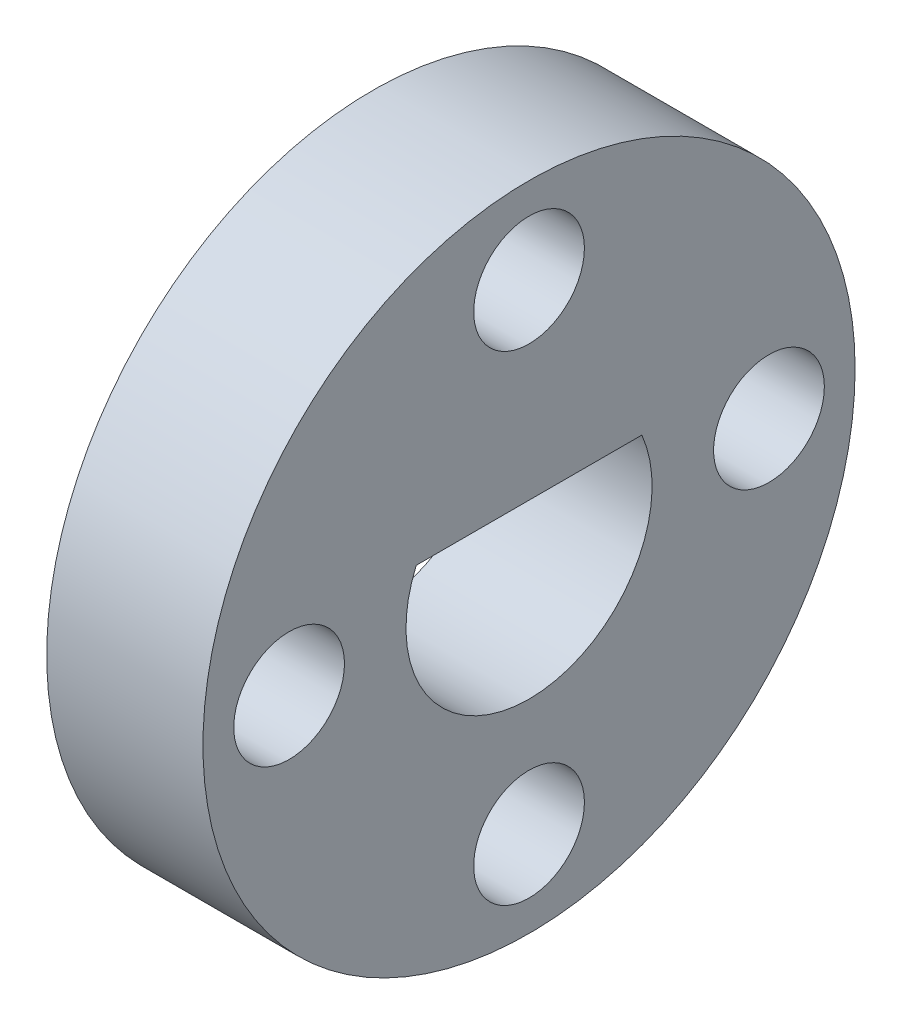
ISO-10303-21;
HEADER;
FILE_DESCRIPTION(('STEP AP214'),'2;1');
FILE_NAME('part.step','',(''),(''),'','','');
FILE_SCHEMA(('AUTOMOTIVE_DESIGN { 1 0 10303 214 1 1 1 1 }'));
ENDSEC;
DATA;
#1=APPLICATION_CONTEXT('core data for automotive mechanical design processes');
#2=APPLICATION_PROTOCOL_DEFINITION('international standard','automotive_design',2000,#1);
#3=PRODUCT_CONTEXT('',#1,'mechanical');
#4=PRODUCT('Part','Part','',(#3));
#5=PRODUCT_RELATED_PRODUCT_CATEGORY('part','',(#4));
#6=PRODUCT_DEFINITION_FORMATION('','',#4);
#7=PRODUCT_DEFINITION_CONTEXT('part definition',#1,'design');
#8=PRODUCT_DEFINITION('design','',#6,#7);
#9=PRODUCT_DEFINITION_SHAPE('','',#8);
#10=(LENGTH_UNIT() NAMED_UNIT(*) SI_UNIT(.MILLI.,.METRE.));
#11=(NAMED_UNIT(*) PLANE_ANGLE_UNIT() SI_UNIT($,.RADIAN.));
#12=(NAMED_UNIT(*) SI_UNIT($,.STERADIAN.) SOLID_ANGLE_UNIT());
#13=UNCERTAINTY_MEASURE_WITH_UNIT(LENGTH_MEASURE(1.E-05),#10,'distance_accuracy_value','');
#14=(GEOMETRIC_REPRESENTATION_CONTEXT(3) GLOBAL_UNCERTAINTY_ASSIGNED_CONTEXT((#13)) GLOBAL_UNIT_ASSIGNED_CONTEXT((#10,
#11,#12)) REPRESENTATION_CONTEXT('',''));
#15=CARTESIAN_POINT('',(0.,0.,0.));
#16=DIRECTION('',(0.,0.,1.));
#17=DIRECTION('',(1.,0.,0.));
#18=AXIS2_PLACEMENT_3D('',#15,#16,#17);
#19=CARTESIAN_POINT('',(6.35,0.,0.));
#20=DIRECTION('',(1.,0.,0.));
#21=DIRECTION('',(0.,0.,-1.));
#22=AXIS2_PLACEMENT_3D('',#19,#20,#21);
#23=PLANE('',#22);
#24=CARTESIAN_POINT('',(6.35,0.,-9.75));
#25=DIRECTION('',(1.,0.,0.));
#26=DIRECTION('',(0.,0.,-1.));
#27=AXIS2_PLACEMENT_3D('',#24,#25,#26);
#28=CIRCLE('',#27,2.25000000000002);
#29=CARTESIAN_POINT('',(6.35,0.,-12.));
#30=VERTEX_POINT('',#29);
#31=EDGE_CURVE('E114',#30,#30,#28,.T.);
#32=ORIENTED_EDGE('',*,*,#31,.F.);
#33=EDGE_LOOP('',(#32));
#34=FACE_BOUND('',#33,.T.);
#35=DIRECTION('',(0.,0.,1.));
#36=VECTOR('',#35,1.);
#37=CARTESIAN_POINT('',(6.35,2.,4.58257569495584));
#38=LINE('',#37,#36);
#39=CARTESIAN_POINT('',(6.35,2.,-4.58257569495584));
#40=VERTEX_POINT('',#39);
#41=CARTESIAN_POINT('',(6.35,2.,4.58257569495584));
#42=VERTEX_POINT('',#41);
#43=EDGE_CURVE('E83',#40,#42,#38,.T.);
#44=ORIENTED_EDGE('',*,*,#43,.F.);
#45=CARTESIAN_POINT('',(6.35,0.,0.));
#46=DIRECTION('',(1.,0.,0.));
#47=DIRECTION('',(0.,0.,-1.));
#48=AXIS2_PLACEMENT_3D('',#45,#46,#47);
#49=CIRCLE('',#48,5.);
#50=EDGE_CURVE('E68',#42,#40,#49,.T.);
#51=ORIENTED_EDGE('',*,*,#50,.F.);
#52=EDGE_LOOP('',(#44,#51));
#53=FACE_BOUND('',#52,.T.);
#54=CARTESIAN_POINT('',(6.35,0.,9.75));
#55=DIRECTION('',(1.,0.,0.));
#56=DIRECTION('',(0.,0.,-1.));
#57=AXIS2_PLACEMENT_3D('',#54,#55,#56);
#58=CIRCLE('',#57,2.25);
#59=CARTESIAN_POINT('',(6.35,0.,7.5));
#60=VERTEX_POINT('',#59);
#61=EDGE_CURVE('E87',#60,#60,#58,.T.);
#62=ORIENTED_EDGE('',*,*,#61,.F.);
#63=EDGE_LOOP('',(#62));
#64=FACE_BOUND('',#63,.T.);
#65=CARTESIAN_POINT('',(6.35,0.,0.));
#66=DIRECTION('',(1.,0.,0.));
#67=DIRECTION('',(0.,0.,-1.));
#68=AXIS2_PLACEMENT_3D('',#65,#66,#67);
#69=CIRCLE('',#68,13.25);
#70=CARTESIAN_POINT('',(6.35,0.,-13.25));
#71=VERTEX_POINT('',#70);
#72=EDGE_CURVE('E11',#71,#71,#69,.T.);
#73=ORIENTED_EDGE('',*,*,#72,.T.);
#74=EDGE_LOOP('',(#73));
#75=FACE_BOUND('',#74,.T.);
#76=CARTESIAN_POINT('',(6.35,9.75,0.));
#77=DIRECTION('',(1.,0.,0.));
#78=DIRECTION('',(0.,0.,-1.));
#79=AXIS2_PLACEMENT_3D('',#76,#77,#78);
#80=CIRCLE('',#79,2.25000000000001);
#81=CARTESIAN_POINT('',(6.35,9.75,-2.25000000000001));
#82=VERTEX_POINT('',#81);
#83=EDGE_CURVE('E77',#82,#82,#80,.T.);
#84=ORIENTED_EDGE('',*,*,#83,.F.);
#85=EDGE_LOOP('',(#84));
#86=FACE_BOUND('',#85,.T.);
#87=CARTESIAN_POINT('',(6.35,-9.75,0.));
#88=DIRECTION('',(1.,0.,0.));
#89=DIRECTION('',(0.,0.,-1.));
#90=AXIS2_PLACEMENT_3D('',#87,#88,#89);
#91=CIRCLE('',#90,2.25000000000003);
#92=CARTESIAN_POINT('',(6.35,-9.75,-2.25000000000003));
#93=VERTEX_POINT('',#92);
#94=EDGE_CURVE('E124',#93,#93,#91,.T.);
#95=ORIENTED_EDGE('',*,*,#94,.F.);
#96=EDGE_LOOP('',(#95));
#97=FACE_BOUND('',#96,.T.);
#98=ADVANCED_FACE('F36',(#34,#53,#64,#75,#86,#97),#23,.T.);
#99=CARTESIAN_POINT('',(0.,0.,0.));
#100=DIRECTION('',(1.,0.,0.));
#101=DIRECTION('',(0.,0.,-1.));
#102=AXIS2_PLACEMENT_3D('',#99,#100,#101);
#103=PLANE('',#102);
#104=CARTESIAN_POINT('',(0.,0.,9.75));
#105=DIRECTION('',(1.,0.,0.));
#106=DIRECTION('',(0.,0.,-1.));
#107=AXIS2_PLACEMENT_3D('',#104,#105,#106);
#108=CIRCLE('',#107,2.25);
#109=CARTESIAN_POINT('',(0.,0.,7.5));
#110=VERTEX_POINT('',#109);
#111=EDGE_CURVE('E73',#110,#110,#108,.T.);
#112=ORIENTED_EDGE('',*,*,#111,.T.);
#113=EDGE_LOOP('',(#112));
#114=FACE_BOUND('',#113,.T.);
#115=CARTESIAN_POINT('',(0.,0.,0.));
#116=DIRECTION('',(1.,0.,0.));
#117=DIRECTION('',(0.,0.,-1.));
#118=AXIS2_PLACEMENT_3D('',#115,#116,#117);
#119=CIRCLE('',#118,13.25);
#120=CARTESIAN_POINT('',(0.,0.,-13.25));
#121=VERTEX_POINT('',#120);
#122=EDGE_CURVE('E40',#121,#121,#119,.T.);
#123=ORIENTED_EDGE('',*,*,#122,.F.);
#124=EDGE_LOOP('',(#123));
#125=FACE_BOUND('',#124,.T.);
#126=CARTESIAN_POINT('',(0.,0.,0.));
#127=DIRECTION('',(1.,0.,0.));
#128=DIRECTION('',(0.,0.,-1.));
#129=AXIS2_PLACEMENT_3D('',#126,#127,#128);
#130=CIRCLE('',#129,5.);
#131=CARTESIAN_POINT('',(0.,2.,4.58257569495584));
#132=VERTEX_POINT('',#131);
#133=CARTESIAN_POINT('',(0.,2.,-4.58257569495584));
#134=VERTEX_POINT('',#133);
#135=EDGE_CURVE('E58',#132,#134,#130,.T.);
#136=ORIENTED_EDGE('',*,*,#135,.T.);
#137=DIRECTION('',(0.,0.,1.));
#138=VECTOR('',#137,1.);
#139=CARTESIAN_POINT('',(0.,2.,4.58257569495584));
#140=LINE('',#139,#138);
#141=EDGE_CURVE('E64',#134,#132,#140,.T.);
#142=ORIENTED_EDGE('',*,*,#141,.T.);
#143=EDGE_LOOP('',(#136,#142));
#144=FACE_BOUND('',#143,.T.);
#145=CARTESIAN_POINT('',(0.,9.75,0.));
#146=DIRECTION('',(1.,0.,0.));
#147=DIRECTION('',(0.,0.,-1.));
#148=AXIS2_PLACEMENT_3D('',#145,#146,#147);
#149=CIRCLE('',#148,2.25000000000001);
#150=CARTESIAN_POINT('',(0.,9.75,-2.25000000000001));
#151=VERTEX_POINT('',#150);
#152=EDGE_CURVE('E80',#151,#151,#149,.T.);
#153=ORIENTED_EDGE('',*,*,#152,.T.);
#154=EDGE_LOOP('',(#153));
#155=FACE_BOUND('',#154,.T.);
#156=CARTESIAN_POINT('',(0.,0.,-9.75));
#157=DIRECTION('',(1.,0.,0.));
#158=DIRECTION('',(0.,0.,-1.));
#159=AXIS2_PLACEMENT_3D('',#156,#157,#158);
#160=CIRCLE('',#159,2.25000000000002);
#161=CARTESIAN_POINT('',(0.,0.,-12.));
#162=VERTEX_POINT('',#161);
#163=EDGE_CURVE('E126',#162,#162,#160,.T.);
#164=ORIENTED_EDGE('',*,*,#163,.T.);
#165=EDGE_LOOP('',(#164));
#166=FACE_BOUND('',#165,.T.);
#167=CARTESIAN_POINT('',(0.,-9.75,0.));
#168=DIRECTION('',(1.,0.,0.));
#169=DIRECTION('',(0.,0.,-1.));
#170=AXIS2_PLACEMENT_3D('',#167,#168,#169);
#171=CIRCLE('',#170,2.25000000000003);
#172=CARTESIAN_POINT('',(0.,-9.75,-2.25000000000003));
#173=VERTEX_POINT('',#172);
#174=EDGE_CURVE('E127',#173,#173,#171,.T.);
#175=ORIENTED_EDGE('',*,*,#174,.T.);
#176=EDGE_LOOP('',(#175));
#177=FACE_BOUND('',#176,.T.);
#178=ADVANCED_FACE('F75',(#114,#125,#144,#155,#166,#177),#103,.F.);
#179=CARTESIAN_POINT('',(6.35,0.,0.));
#180=DIRECTION('',(-1.,0.,0.));
#181=DIRECTION('',(0.,0.,1.));
#182=AXIS2_PLACEMENT_3D('',#179,#180,#181);
#183=CYLINDRICAL_SURFACE('',#182,13.25);
#184=ORIENTED_EDGE('',*,*,#72,.F.);
#185=EDGE_LOOP('',(#184));
#186=FACE_BOUND('',#185,.T.);
#187=ORIENTED_EDGE('',*,*,#122,.T.);
#188=EDGE_LOOP('',(#187));
#189=FACE_BOUND('',#188,.T.);
#190=ADVANCED_FACE('F38',(#186,#189),#183,.T.);
#191=CARTESIAN_POINT('',(6.35,0.,9.75));
#192=DIRECTION('',(-1.,0.,0.));
#193=DIRECTION('',(0.,0.,1.));
#194=AXIS2_PLACEMENT_3D('',#191,#192,#193);
#195=CYLINDRICAL_SURFACE('',#194,2.25);
#196=ORIENTED_EDGE('',*,*,#61,.T.);
#197=EDGE_LOOP('',(#196));
#198=FACE_BOUND('',#197,.T.);
#199=ORIENTED_EDGE('',*,*,#111,.F.);
#200=EDGE_LOOP('',(#199));
#201=FACE_BOUND('',#200,.T.);
#202=ADVANCED_FACE('F95',(#198,#201),#195,.F.);
#203=CARTESIAN_POINT('',(6.35,0.,0.));
#204=DIRECTION('',(-1.,0.,0.));
#205=DIRECTION('',(0.,0.,1.));
#206=AXIS2_PLACEMENT_3D('',#203,#204,#205);
#207=CYLINDRICAL_SURFACE('',#206,5.);
#208=ORIENTED_EDGE('',*,*,#135,.F.);
#209=DIRECTION('',(-1.,0.,0.));
#210=VECTOR('',#209,1.);
#211=CARTESIAN_POINT('',(6.35,2.,4.58257569495584));
#212=LINE('',#211,#210);
#213=EDGE_CURVE('E66',#42,#132,#212,.T.);
#214=ORIENTED_EDGE('',*,*,#213,.F.);
#215=ORIENTED_EDGE('',*,*,#50,.T.);
#216=DIRECTION('',(-1.,0.,0.));
#217=VECTOR('',#216,1.);
#218=CARTESIAN_POINT('',(6.35,2.,-4.58257569495584));
#219=LINE('',#218,#217);
#220=EDGE_CURVE('E51',#40,#134,#219,.T.);
#221=ORIENTED_EDGE('',*,*,#220,.T.);
#222=EDGE_LOOP('',(#208,#214,#215,#221));
#223=FACE_BOUND('',#222,.T.);
#224=ADVANCED_FACE('F70',(#223),#207,.F.);
#225=CARTESIAN_POINT('',(6.35,2.,4.58257569495584));
#226=DIRECTION('',(0.,-1.,0.));
#227=DIRECTION('',(0.,0.,-1.));
#228=AXIS2_PLACEMENT_3D('',#225,#226,#227);
#229=PLANE('',#228);
#230=ORIENTED_EDGE('',*,*,#141,.F.);
#231=ORIENTED_EDGE('',*,*,#220,.F.);
#232=ORIENTED_EDGE('',*,*,#43,.T.);
#233=ORIENTED_EDGE('',*,*,#213,.T.);
#234=EDGE_LOOP('',(#230,#231,#232,#233));
#235=FACE_BOUND('',#234,.T.);
#236=ADVANCED_FACE('F65',(#235),#229,.T.);
#237=CARTESIAN_POINT('',(6.35,9.75,0.));
#238=DIRECTION('',(-1.,0.,0.));
#239=DIRECTION('',(0.,0.,1.));
#240=AXIS2_PLACEMENT_3D('',#237,#238,#239);
#241=CYLINDRICAL_SURFACE('',#240,2.25000000000001);
#242=ORIENTED_EDGE('',*,*,#83,.T.);
#243=EDGE_LOOP('',(#242));
#244=FACE_BOUND('',#243,.T.);
#245=ORIENTED_EDGE('',*,*,#152,.F.);
#246=EDGE_LOOP('',(#245));
#247=FACE_BOUND('',#246,.T.);
#248=ADVANCED_FACE('F139',(#244,#247),#241,.F.);
#249=CARTESIAN_POINT('',(6.35,0.,-9.75));
#250=DIRECTION('',(-1.,0.,0.));
#251=DIRECTION('',(0.,0.,1.));
#252=AXIS2_PLACEMENT_3D('',#249,#250,#251);
#253=CYLINDRICAL_SURFACE('',#252,2.25000000000002);
#254=ORIENTED_EDGE('',*,*,#31,.T.);
#255=EDGE_LOOP('',(#254));
#256=FACE_BOUND('',#255,.T.);
#257=ORIENTED_EDGE('',*,*,#163,.F.);
#258=EDGE_LOOP('',(#257));
#259=FACE_BOUND('',#258,.T.);
#260=ADVANCED_FACE('F141',(#256,#259),#253,.F.);
#261=CARTESIAN_POINT('',(6.35,-9.75,0.));
#262=DIRECTION('',(-1.,0.,0.));
#263=DIRECTION('',(0.,0.,1.));
#264=AXIS2_PLACEMENT_3D('',#261,#262,#263);
#265=CYLINDRICAL_SURFACE('',#264,2.25000000000003);
#266=ORIENTED_EDGE('',*,*,#94,.T.);
#267=EDGE_LOOP('',(#266));
#268=FACE_BOUND('',#267,.T.);
#269=ORIENTED_EDGE('',*,*,#174,.F.);
#270=EDGE_LOOP('',(#269));
#271=FACE_BOUND('',#270,.T.);
#272=ADVANCED_FACE('F148',(#268,#271),#265,.F.);
#273=CLOSED_SHELL('',(#98,#178,#190,#202,#224,#236,#248,#260,#272));
#274=MANIFOLD_SOLID_BREP('B2',#273);
#275=ADVANCED_BREP_SHAPE_REPRESENTATION('',(#18,#274),#14);
#276=SHAPE_DEFINITION_REPRESENTATION(#9,#275);
ENDSEC;
END-ISO-10303-21;
